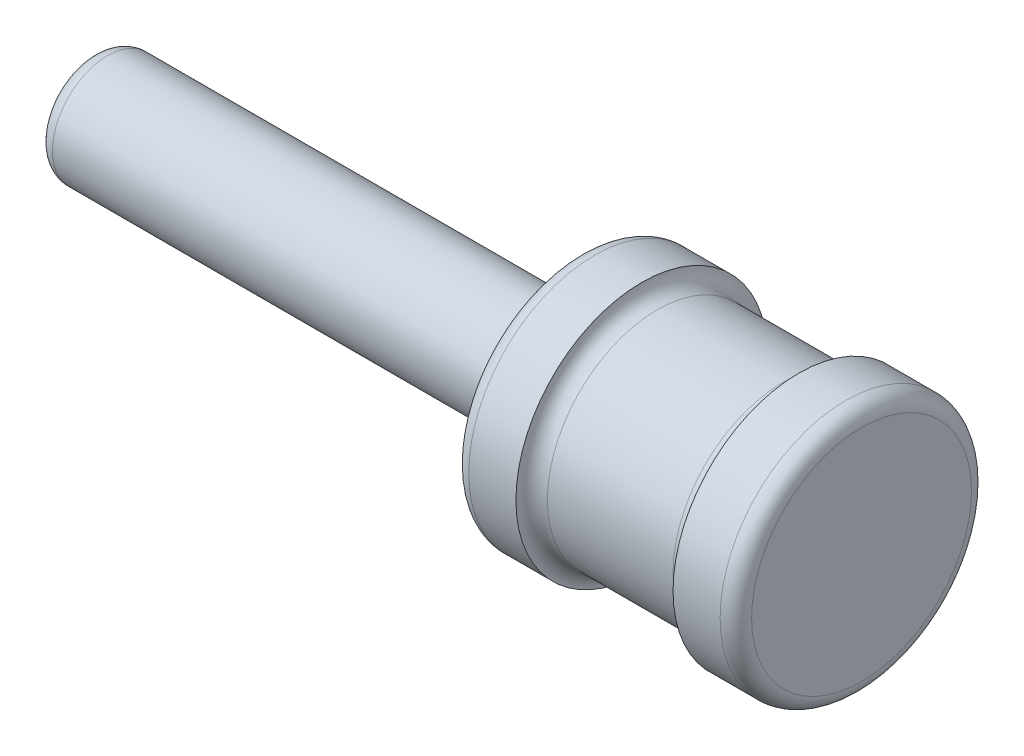
ISO-10303-21;
HEADER;
FILE_DESCRIPTION(('STEP AP214'),'2;1');
FILE_NAME('part.step','',(''),(''),'','','');
FILE_SCHEMA(('AUTOMOTIVE_DESIGN { 1 0 10303 214 1 1 1 1 }'));
ENDSEC;
DATA;
#1=APPLICATION_CONTEXT('core data for automotive mechanical design processes');
#2=APPLICATION_PROTOCOL_DEFINITION('international standard','automotive_design',2000,#1);
#3=PRODUCT_CONTEXT('',#1,'mechanical');
#4=PRODUCT('Part','Part','',(#3));
#5=PRODUCT_RELATED_PRODUCT_CATEGORY('part','',(#4));
#6=PRODUCT_DEFINITION_FORMATION('','',#4);
#7=PRODUCT_DEFINITION_CONTEXT('part definition',#1,'design');
#8=PRODUCT_DEFINITION('design','',#6,#7);
#9=PRODUCT_DEFINITION_SHAPE('','',#8);
#10=(LENGTH_UNIT() NAMED_UNIT(*) SI_UNIT(.MILLI.,.METRE.));
#11=(NAMED_UNIT(*) PLANE_ANGLE_UNIT() SI_UNIT($,.RADIAN.));
#12=(NAMED_UNIT(*) SI_UNIT($,.STERADIAN.) SOLID_ANGLE_UNIT());
#13=UNCERTAINTY_MEASURE_WITH_UNIT(LENGTH_MEASURE(1.E-05),#10,'distance_accuracy_value','');
#14=(GEOMETRIC_REPRESENTATION_CONTEXT(3) GLOBAL_UNCERTAINTY_ASSIGNED_CONTEXT((#13)) GLOBAL_UNIT_ASSIGNED_CONTEXT((#10,
#11,#12)) REPRESENTATION_CONTEXT('',''));
#15=CARTESIAN_POINT('',(0.,0.,0.));
#16=DIRECTION('',(0.,0.,1.));
#17=DIRECTION('',(1.,0.,0.));
#18=AXIS2_PLACEMENT_3D('',#15,#16,#17);
#19=CARTESIAN_POINT('',(0.,4.,0.));
#20=DIRECTION('',(1.,0.,0.));
#21=DIRECTION('',(0.,1.,0.));
#22=AXIS2_PLACEMENT_3D('',#19,#20,#21);
#23=PLANE('',#22);
#24=CARTESIAN_POINT('',(0.,0.,0.));
#25=DIRECTION('',(1.,0.,0.));
#26=DIRECTION('',(0.,1.,0.));
#27=AXIS2_PLACEMENT_3D('',#24,#25,#26);
#28=CIRCLE('',#27,3.5);
#29=CARTESIAN_POINT('',(0.,3.5,0.));
#30=VERTEX_POINT('',#29);
#31=EDGE_CURVE('E54',#30,#30,#28,.T.);
#32=ORIENTED_EDGE('',*,*,#31,.T.);
#33=EDGE_LOOP('',(#32));
#34=FACE_BOUND('',#33,.T.);
#35=ADVANCED_FACE('F31',(#34),#23,.T.);
#36=CARTESIAN_POINT('',(-24.5,0.,0.));
#37=DIRECTION('',(-1.,0.,0.));
#38=DIRECTION('',(0.,-1.,0.));
#39=AXIS2_PLACEMENT_3D('',#36,#37,#38);
#40=PLANE('',#39);
#41=CARTESIAN_POINT('',(-24.5,0.,0.));
#42=DIRECTION('',(-1.,0.,0.));
#43=DIRECTION('',(0.,-1.,0.));
#44=AXIS2_PLACEMENT_3D('',#41,#42,#43);
#45=CIRCLE('',#44,1.24999999999998);
#46=CARTESIAN_POINT('',(-24.5,-1.24999999999999,0.));
#47=VERTEX_POINT('',#46);
#48=EDGE_CURVE('E57',#47,#47,#45,.T.);
#49=ORIENTED_EDGE('',*,*,#48,.T.);
#50=EDGE_LOOP('',(#49));
#51=FACE_BOUND('',#50,.T.);
#52=ADVANCED_FACE('F88',(#51),#40,.T.);
#53=CARTESIAN_POINT('',(0.,0.,0.));
#54=DIRECTION('',(1.,0.,0.));
#55=DIRECTION('',(0.,1.,0.));
#56=AXIS2_PLACEMENT_3D('',#53,#54,#55);
#57=CYLINDRICAL_SURFACE('',#56,1.74999999999998);
#58=CARTESIAN_POINT('',(-24.,0.,0.));
#59=DIRECTION('',(-1.,0.,0.));
#60=DIRECTION('',(0.,-1.,0.));
#61=AXIS2_PLACEMENT_3D('',#58,#59,#60);
#62=CIRCLE('',#61,1.74999999999998);
#63=CARTESIAN_POINT('',(-24.,-1.74999999999999,0.));
#64=VERTEX_POINT('',#63);
#65=EDGE_CURVE('E60',#64,#64,#62,.F.);
#66=ORIENTED_EDGE('',*,*,#65,.T.);
#67=EDGE_LOOP('',(#66));
#68=FACE_BOUND('',#67,.T.);
#69=CARTESIAN_POINT('',(-9.00000000000001,0.,0.));
#70=DIRECTION('',(1.,0.,0.));
#71=DIRECTION('',(0.,1.,0.));
#72=AXIS2_PLACEMENT_3D('',#69,#70,#71);
#73=CIRCLE('',#72,1.74999999999998);
#74=CARTESIAN_POINT('',(-9.00000000000001,1.74999999999998,0.));
#75=VERTEX_POINT('',#74);
#76=EDGE_CURVE('E63',#75,#75,#73,.T.);
#77=ORIENTED_EDGE('',*,*,#76,.F.);
#78=EDGE_LOOP('',(#77));
#79=FACE_BOUND('',#78,.T.);
#80=ADVANCED_FACE('F94',(#68,#79),#57,.T.);
#81=CARTESIAN_POINT('',(-9.00000000000001,1.74999999999998,0.));
#82=DIRECTION('',(-1.,0.,0.));
#83=DIRECTION('',(0.,-1.,0.));
#84=AXIS2_PLACEMENT_3D('',#81,#82,#83);
#85=PLANE('',#84);
#86=CARTESIAN_POINT('',(-9.00000000000001,0.,0.));
#87=DIRECTION('',(-1.,0.,0.));
#88=DIRECTION('',(0.,-1.,0.));
#89=AXIS2_PLACEMENT_3D('',#86,#87,#88);
#90=CIRCLE('',#89,3.49999999999999);
#91=CARTESIAN_POINT('',(-9.00000000000001,-3.49999999999999,0.));
#92=VERTEX_POINT('',#91);
#93=EDGE_CURVE('E42',#92,#92,#90,.T.);
#94=ORIENTED_EDGE('',*,*,#93,.T.);
#95=EDGE_LOOP('',(#94));
#96=FACE_BOUND('',#95,.T.);
#97=ORIENTED_EDGE('',*,*,#76,.T.);
#98=EDGE_LOOP('',(#97));
#99=FACE_BOUND('',#98,.T.);
#100=ADVANCED_FACE('F122',(#96,#99),#85,.T.);
#101=CARTESIAN_POINT('',(0.,0.,0.));
#102=DIRECTION('',(1.,0.,0.));
#103=DIRECTION('',(0.,1.,0.));
#104=AXIS2_PLACEMENT_3D('',#101,#102,#103);
#105=CYLINDRICAL_SURFACE('',#104,3.99999999999999);
#106=CARTESIAN_POINT('',(-8.50000000000001,0.,0.));
#107=DIRECTION('',(-1.,0.,0.));
#108=DIRECTION('',(0.,-1.,0.));
#109=AXIS2_PLACEMENT_3D('',#106,#107,#108);
#110=CIRCLE('',#109,3.99999999999999);
#111=CARTESIAN_POINT('',(-8.50000000000001,-3.99999999999999,0.));
#112=VERTEX_POINT('',#111);
#113=EDGE_CURVE('E46',#112,#112,#110,.F.);
#114=ORIENTED_EDGE('',*,*,#113,.T.);
#115=EDGE_LOOP('',(#114));
#116=FACE_BOUND('',#115,.T.);
#117=CARTESIAN_POINT('',(-7.00000000000001,0.,0.));
#118=DIRECTION('',(1.,0.,0.));
#119=DIRECTION('',(0.,1.,0.));
#120=AXIS2_PLACEMENT_3D('',#117,#118,#119);
#121=CIRCLE('',#120,3.99999999999999);
#122=CARTESIAN_POINT('',(-7.00000000000001,3.99999999999999,0.));
#123=VERTEX_POINT('',#122);
#124=EDGE_CURVE('E66',#123,#123,#121,.T.);
#125=ORIENTED_EDGE('',*,*,#124,.F.);
#126=EDGE_LOOP('',(#125));
#127=FACE_BOUND('',#126,.T.);
#128=ADVANCED_FACE('F117',(#116,#127),#105,.T.);
#129=CARTESIAN_POINT('',(0.,0.,0.));
#130=DIRECTION('',(1.,0.,0.));
#131=DIRECTION('',(0.,1.,0.));
#132=AXIS2_PLACEMENT_3D('',#129,#130,#131);
#133=CYLINDRICAL_SURFACE('',#132,3.49999999999999);
#134=CARTESIAN_POINT('',(-2.5,0.,0.));
#135=DIRECTION('',(-1.,0.,0.));
#136=DIRECTION('',(0.,-1.,0.));
#137=AXIS2_PLACEMENT_3D('',#134,#135,#136);
#138=CIRCLE('',#137,3.49999999999999);
#139=CARTESIAN_POINT('',(-2.5,-3.49999999999999,0.));
#140=VERTEX_POINT('',#139);
#141=EDGE_CURVE('E10',#140,#140,#138,.T.);
#142=ORIENTED_EDGE('',*,*,#141,.T.);
#143=EDGE_LOOP('',(#142));
#144=FACE_BOUND('',#143,.T.);
#145=CARTESIAN_POINT('',(-6.50000000000001,0.,0.));
#146=DIRECTION('',(1.,0.,0.));
#147=DIRECTION('',(0.,1.,0.));
#148=AXIS2_PLACEMENT_3D('',#145,#146,#147);
#149=CIRCLE('',#148,3.49999999999999);
#150=CARTESIAN_POINT('',(-6.50000000000001,3.49999999999999,0.));
#151=VERTEX_POINT('',#150);
#152=EDGE_CURVE('E38',#151,#151,#149,.T.);
#153=ORIENTED_EDGE('',*,*,#152,.T.);
#154=EDGE_LOOP('',(#153));
#155=FACE_BOUND('',#154,.T.);
#156=ADVANCED_FACE('F112',(#144,#155),#133,.T.);
#157=CARTESIAN_POINT('',(0.,0.,0.));
#158=DIRECTION('',(1.,0.,0.));
#159=DIRECTION('',(0.,1.,0.));
#160=AXIS2_PLACEMENT_3D('',#157,#158,#159);
#161=CYLINDRICAL_SURFACE('',#160,4.);
#162=CARTESIAN_POINT('',(-0.5,0.,0.));
#163=DIRECTION('',(1.,0.,0.));
#164=DIRECTION('',(0.,1.,0.));
#165=AXIS2_PLACEMENT_3D('',#162,#163,#164);
#166=CIRCLE('',#165,4.);
#167=CARTESIAN_POINT('',(-0.5,4.,0.));
#168=VERTEX_POINT('',#167);
#169=EDGE_CURVE('E51',#168,#168,#166,.F.);
#170=ORIENTED_EDGE('',*,*,#169,.T.);
#171=EDGE_LOOP('',(#170));
#172=FACE_BOUND('',#171,.T.);
#173=CARTESIAN_POINT('',(-2.,0.,0.));
#174=DIRECTION('',(1.,0.,0.));
#175=DIRECTION('',(0.,1.,0.));
#176=AXIS2_PLACEMENT_3D('',#173,#174,#175);
#177=CIRCLE('',#176,4.);
#178=CARTESIAN_POINT('',(-2.,4.,0.));
#179=VERTEX_POINT('',#178);
#180=EDGE_CURVE('E69',#179,#179,#177,.T.);
#181=ORIENTED_EDGE('',*,*,#180,.T.);
#182=EDGE_LOOP('',(#181));
#183=FACE_BOUND('',#182,.T.);
#184=ADVANCED_FACE('F73',(#172,#183),#161,.T.);
#185=CARTESIAN_POINT('',(-24.,0.,0.));
#186=DIRECTION('',(-1.,0.,0.));
#187=DIRECTION('',(0.,-1.,0.));
#188=AXIS2_PLACEMENT_3D('',#185,#186,#187);
#189=TOROIDAL_SURFACE('',#188,1.24999999999998,0.5);
#190=ORIENTED_EDGE('',*,*,#48,.F.);
#191=EDGE_LOOP('',(#190));
#192=FACE_BOUND('',#191,.T.);
#193=ORIENTED_EDGE('',*,*,#65,.F.);
#194=EDGE_LOOP('',(#193));
#195=FACE_BOUND('',#194,.T.);
#196=ADVANCED_FACE('F99',(#192,#195),#189,.T.);
#197=CARTESIAN_POINT('',(-0.5,0.,0.));
#198=DIRECTION('',(1.,0.,0.));
#199=DIRECTION('',(0.,1.,0.));
#200=AXIS2_PLACEMENT_3D('',#197,#198,#199);
#201=TOROIDAL_SURFACE('',#200,3.5,0.5);
#202=ORIENTED_EDGE('',*,*,#169,.F.);
#203=EDGE_LOOP('',(#202));
#204=FACE_BOUND('',#203,.T.);
#205=ORIENTED_EDGE('',*,*,#31,.F.);
#206=EDGE_LOOP('',(#205));
#207=FACE_BOUND('',#206,.T.);
#208=ADVANCED_FACE('F84',(#204,#207),#201,.T.);
#209=CARTESIAN_POINT('',(-8.50000000000001,0.,0.));
#210=DIRECTION('',(-1.,0.,0.));
#211=DIRECTION('',(0.,-1.,0.));
#212=AXIS2_PLACEMENT_3D('',#209,#210,#211);
#213=TOROIDAL_SURFACE('',#212,3.49999999999999,0.5);
#214=ORIENTED_EDGE('',*,*,#93,.F.);
#215=EDGE_LOOP('',(#214));
#216=FACE_BOUND('',#215,.T.);
#217=ORIENTED_EDGE('',*,*,#113,.F.);
#218=EDGE_LOOP('',(#217));
#219=FACE_BOUND('',#218,.T.);
#220=ADVANCED_FACE('F77',(#216,#219),#213,.T.);
#221=CARTESIAN_POINT('',(-2.5,0.,0.));
#222=DIRECTION('',(-1.,0.,0.));
#223=DIRECTION('',(0.,-1.,0.));
#224=AXIS2_PLACEMENT_3D('',#221,#222,#223);
#225=TOROIDAL_SURFACE('',#224,3.99999999999999,0.5);
#226=ORIENTED_EDGE('',*,*,#141,.F.);
#227=EDGE_LOOP('',(#226));
#228=FACE_BOUND('',#227,.T.);
#229=ORIENTED_EDGE('',*,*,#180,.F.);
#230=EDGE_LOOP('',(#229));
#231=FACE_BOUND('',#230,.T.);
#232=ADVANCED_FACE('F75',(#228,#231),#225,.F.);
#233=CARTESIAN_POINT('',(-6.50000000000001,0.,0.));
#234=DIRECTION('',(1.,0.,0.));
#235=DIRECTION('',(0.,1.,0.));
#236=AXIS2_PLACEMENT_3D('',#233,#234,#235);
#237=TOROIDAL_SURFACE('',#236,3.99999999999999,0.5);
#238=ORIENTED_EDGE('',*,*,#124,.T.);
#239=EDGE_LOOP('',(#238));
#240=FACE_BOUND('',#239,.T.);
#241=ORIENTED_EDGE('',*,*,#152,.F.);
#242=EDGE_LOOP('',(#241));
#243=FACE_BOUND('',#242,.T.);
#244=ADVANCED_FACE('F33',(#240,#243),#237,.F.);
#245=CLOSED_SHELL('',(#35,#52,#80,#100,#128,#156,#184,#196,#208,#220,#232,#244));
#246=MANIFOLD_SOLID_BREP('B2',#245);
#247=ADVANCED_BREP_SHAPE_REPRESENTATION('',(#18,#246),#14);
#248=SHAPE_DEFINITION_REPRESENTATION(#9,#247);
ENDSEC;
END-ISO-10303-21;
